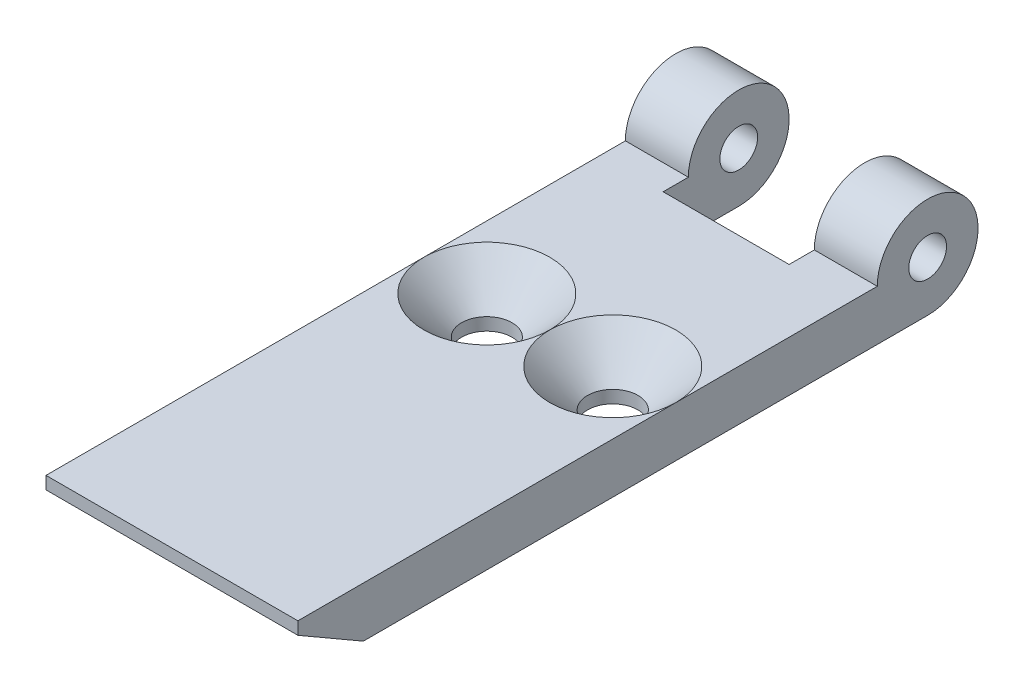
ISO-10303-21;
HEADER;
FILE_DESCRIPTION(('STEP AP214'),'2;1');
FILE_NAME('part.step','',(''),(''),'','','');
FILE_SCHEMA(('AUTOMOTIVE_DESIGN { 1 0 10303 214 1 1 1 1 }'));
ENDSEC;
DATA;
#1=APPLICATION_CONTEXT('core data for automotive mechanical design processes');
#2=APPLICATION_PROTOCOL_DEFINITION('international standard','automotive_design',2000,#1);
#3=PRODUCT_CONTEXT('',#1,'mechanical');
#4=PRODUCT('Part','Part','',(#3));
#5=PRODUCT_RELATED_PRODUCT_CATEGORY('part','',(#4));
#6=PRODUCT_DEFINITION_FORMATION('','',#4);
#7=PRODUCT_DEFINITION_CONTEXT('part definition',#1,'design');
#8=PRODUCT_DEFINITION('design','',#6,#7);
#9=PRODUCT_DEFINITION_SHAPE('','',#8);
#10=(LENGTH_UNIT() NAMED_UNIT(*) SI_UNIT(.MILLI.,.METRE.));
#11=(NAMED_UNIT(*) PLANE_ANGLE_UNIT() SI_UNIT($,.RADIAN.));
#12=(NAMED_UNIT(*) SI_UNIT($,.STERADIAN.) SOLID_ANGLE_UNIT());
#13=UNCERTAINTY_MEASURE_WITH_UNIT(LENGTH_MEASURE(1.E-05),#10,'distance_accuracy_value','');
#14=(GEOMETRIC_REPRESENTATION_CONTEXT(3) GLOBAL_UNCERTAINTY_ASSIGNED_CONTEXT((#13)) GLOBAL_UNIT_ASSIGNED_CONTEXT((#10,
#11,#12)) REPRESENTATION_CONTEXT('',''));
#15=CARTESIAN_POINT('',(0.,0.,0.));
#16=DIRECTION('',(0.,0.,1.));
#17=DIRECTION('',(1.,0.,0.));
#18=AXIS2_PLACEMENT_3D('',#15,#16,#17);
#19=CARTESIAN_POINT('',(10.,0.,50.));
#20=DIRECTION('',(0.,-1.,0.));
#21=DIRECTION('',(0.,0.,-1.));
#22=AXIS2_PLACEMENT_3D('',#19,#20,#21);
#23=PLANE('',#22);
#24=DIRECTION('',(0.,0.,1.));
#25=VECTOR('',#24,1.);
#26=CARTESIAN_POINT('',(10.,0.,50.));
#27=LINE('',#26,#25);
#28=CARTESIAN_POINT('',(10.,0.,20.));
#29=VERTEX_POINT('',#28);
#30=CARTESIAN_POINT('',(10.,0.,50.));
#31=VERTEX_POINT('',#30);
#32=EDGE_CURVE('E172',#29,#31,#27,.T.);
#33=ORIENTED_EDGE('',*,*,#32,.F.);
#34=CARTESIAN_POINT('',(5.,0.,20.));
#35=DIRECTION('',(0.,-1.,0.));
#36=DIRECTION('',(0.,0.,-1.));
#37=AXIS2_PLACEMENT_3D('',#34,#35,#36);
#38=CIRCLE('',#37,5.);
#39=CARTESIAN_POINT('',(0.,0.,20.));
#40=VERTEX_POINT('',#39);
#41=EDGE_CURVE('E219',#29,#40,#38,.T.);
#42=ORIENTED_EDGE('',*,*,#41,.T.);
#43=CARTESIAN_POINT('',(-5.,0.,20.));
#44=DIRECTION('',(0.,-1.,0.));
#45=DIRECTION('',(0.,0.,-1.));
#46=AXIS2_PLACEMENT_3D('',#43,#44,#45);
#47=CIRCLE('',#46,5.);
#48=CARTESIAN_POINT('',(-10.,0.,20.));
#49=VERTEX_POINT('',#48);
#50=EDGE_CURVE('E51',#40,#49,#47,.T.);
#51=ORIENTED_EDGE('',*,*,#50,.T.);
#52=DIRECTION('',(0.,0.,1.));
#53=VECTOR('',#52,1.);
#54=CARTESIAN_POINT('',(-10.,0.,50.));
#55=LINE('',#54,#53);
#56=CARTESIAN_POINT('',(-10.,0.,50.));
#57=VERTEX_POINT('',#56);
#58=EDGE_CURVE('E186',#49,#57,#55,.T.);
#59=ORIENTED_EDGE('',*,*,#58,.T.);
#60=DIRECTION('',(-1.,0.,0.));
#61=VECTOR('',#60,1.);
#62=CARTESIAN_POINT('',(10.,0.,50.));
#63=LINE('',#62,#61);
#64=EDGE_CURVE('E204',#31,#57,#63,.T.);
#65=ORIENTED_EDGE('',*,*,#64,.F.);
#66=EDGE_LOOP('',(#33,#42,#51,#59,#65));
#67=FACE_BOUND('',#66,.T.);
#68=ADVANCED_FACE('F36',(#67),#23,.F.);
#69=CARTESIAN_POINT('',(10.,0.,0.));
#70=DIRECTION('',(-1.,0.,0.));
#71=DIRECTION('',(0.,0.,1.));
#72=AXIS2_PLACEMENT_3D('',#69,#70,#71);
#73=CYLINDRICAL_SURFACE('',#72,4.);
#74=CARTESIAN_POINT('',(5.,0.,0.));
#75=DIRECTION('',(1.,0.,0.));
#76=DIRECTION('',(0.,0.,-1.));
#77=AXIS2_PLACEMENT_3D('',#74,#75,#76);
#78=CIRCLE('',#77,4.);
#79=CARTESIAN_POINT('',(5.,-4.00000000000001,0.));
#80=VERTEX_POINT('',#79);
#81=CARTESIAN_POINT('',(5.,0.,4.));
#82=VERTEX_POINT('',#81);
#83=EDGE_CURVE('E134',#80,#82,#78,.T.);
#84=ORIENTED_EDGE('',*,*,#83,.T.);
#85=DIRECTION('',(-1.,0.,0.));
#86=VECTOR('',#85,1.);
#87=CARTESIAN_POINT('',(10.,0.,4.));
#88=LINE('',#87,#86);
#89=CARTESIAN_POINT('',(10.,0.,4.));
#90=VERTEX_POINT('',#89);
#91=EDGE_CURVE('E208',#90,#82,#88,.T.);
#92=ORIENTED_EDGE('',*,*,#91,.F.);
#93=CARTESIAN_POINT('',(10.,0.,0.));
#94=DIRECTION('',(1.,0.,0.));
#95=DIRECTION('',(0.,0.,-1.));
#96=AXIS2_PLACEMENT_3D('',#93,#94,#95);
#97=CIRCLE('',#96,4.);
#98=CARTESIAN_POINT('',(10.,-4.,0.));
#99=VERTEX_POINT('',#98);
#100=EDGE_CURVE('E169',#99,#90,#97,.T.);
#101=ORIENTED_EDGE('',*,*,#100,.F.);
#102=DIRECTION('',(-1.,0.,0.));
#103=VECTOR('',#102,1.);
#104=CARTESIAN_POINT('',(10.,-4.,0.));
#105=LINE('',#104,#103);
#106=EDGE_CURVE('E196',#99,#80,#105,.T.);
#107=ORIENTED_EDGE('',*,*,#106,.T.);
#108=EDGE_LOOP('',(#84,#92,#101,#107));
#109=FACE_BOUND('',#108,.T.);
#110=ADVANCED_FACE('F242',(#109),#73,.T.);
#111=CARTESIAN_POINT('',(10.,0.,0.));
#112=DIRECTION('',(-1.,0.,0.));
#113=DIRECTION('',(0.,0.,1.));
#114=AXIS2_PLACEMENT_3D('',#111,#112,#113);
#115=CYLINDRICAL_SURFACE('',#114,1.5);
#116=CARTESIAN_POINT('',(5.,0.,0.));
#117=DIRECTION('',(1.,0.,0.));
#118=DIRECTION('',(0.,0.,-1.));
#119=AXIS2_PLACEMENT_3D('',#116,#117,#118);
#120=CIRCLE('',#119,1.5);
#121=CARTESIAN_POINT('',(5.,0.,-1.5));
#122=VERTEX_POINT('',#121);
#123=EDGE_CURVE('E157',#122,#122,#120,.T.);
#124=ORIENTED_EDGE('',*,*,#123,.F.);
#125=EDGE_LOOP('',(#124));
#126=FACE_BOUND('',#125,.T.);
#127=CARTESIAN_POINT('',(10.,0.,0.));
#128=DIRECTION('',(1.,0.,0.));
#129=DIRECTION('',(0.,0.,-1.));
#130=AXIS2_PLACEMENT_3D('',#127,#128,#129);
#131=CIRCLE('',#130,1.5);
#132=CARTESIAN_POINT('',(10.,0.,-1.5));
#133=VERTEX_POINT('',#132);
#134=EDGE_CURVE('E163',#133,#133,#131,.T.);
#135=ORIENTED_EDGE('',*,*,#134,.T.);
#136=EDGE_LOOP('',(#135));
#137=FACE_BOUND('',#136,.T.);
#138=ADVANCED_FACE('F247',(#126,#137),#115,.F.);
#139=CARTESIAN_POINT('',(10.,0.,0.));
#140=DIRECTION('',(1.,0.,0.));
#141=DIRECTION('',(0.,0.,-1.));
#142=AXIS2_PLACEMENT_3D('',#139,#140,#141);
#143=PLANE('',#142);
#144=ORIENTED_EDGE('',*,*,#100,.T.);
#145=EDGE_CURVE('E174',#90,#29,#27,.T.);
#146=ORIENTED_EDGE('',*,*,#145,.T.);
#147=ORIENTED_EDGE('',*,*,#32,.T.);
#148=DIRECTION('',(0.,-1.,0.));
#149=VECTOR('',#148,1.);
#150=CARTESIAN_POINT('',(10.,-1.,50.));
#151=LINE('',#150,#149);
#152=CARTESIAN_POINT('',(10.,-1.,50.));
#153=VERTEX_POINT('',#152);
#154=EDGE_CURVE('E177',#31,#153,#151,.T.);
#155=ORIENTED_EDGE('',*,*,#154,.T.);
#156=DIRECTION('',(0.,-0.500000000000001,-0.866025403784438));
#157=VECTOR('',#156,1.);
#158=CARTESIAN_POINT('',(10.,-4.00000000000001,44.8038475772934));
#159=LINE('',#158,#157);
#160=CARTESIAN_POINT('',(10.,-4.00000000000001,44.8038475772934));
#161=VERTEX_POINT('',#160);
#162=EDGE_CURVE('E179',#153,#161,#159,.T.);
#163=ORIENTED_EDGE('',*,*,#162,.T.);
#164=DIRECTION('',(0.,0.,-1.));
#165=VECTOR('',#164,1.);
#166=CARTESIAN_POINT('',(10.,-4.,0.));
#167=LINE('',#166,#165);
#168=EDGE_CURVE('E181',#161,#99,#167,.T.);
#169=ORIENTED_EDGE('',*,*,#168,.T.);
#170=EDGE_LOOP('',(#144,#146,#147,#155,#163,#169));
#171=FACE_BOUND('',#170,.T.);
#172=ORIENTED_EDGE('',*,*,#134,.F.);
#173=EDGE_LOOP('',(#172));
#174=FACE_BOUND('',#173,.T.);
#175=ADVANCED_FACE('F265',(#171,#174),#143,.T.);
#176=CARTESIAN_POINT('',(-10.,0.,0.));
#177=DIRECTION('',(1.,0.,0.));
#178=DIRECTION('',(0.,0.,-1.));
#179=AXIS2_PLACEMENT_3D('',#176,#177,#178);
#180=PLANE('',#179);
#181=CARTESIAN_POINT('',(-10.,0.,0.));
#182=DIRECTION('',(1.,0.,0.));
#183=DIRECTION('',(0.,0.,-1.));
#184=AXIS2_PLACEMENT_3D('',#181,#182,#183);
#185=CIRCLE('',#184,4.);
#186=CARTESIAN_POINT('',(-10.,-4.,0.));
#187=VERTEX_POINT('',#186);
#188=CARTESIAN_POINT('',(-10.,0.,4.));
#189=VERTEX_POINT('',#188);
#190=EDGE_CURVE('E166',#187,#189,#185,.T.);
#191=ORIENTED_EDGE('',*,*,#190,.F.);
#192=DIRECTION('',(0.,0.,-1.));
#193=VECTOR('',#192,1.);
#194=CARTESIAN_POINT('',(-10.,-4.,0.));
#195=LINE('',#194,#193);
#196=CARTESIAN_POINT('',(-10.,-4.00000000000001,44.8038475772934));
#197=VERTEX_POINT('',#196);
#198=EDGE_CURVE('E173',#197,#187,#195,.T.);
#199=ORIENTED_EDGE('',*,*,#198,.F.);
#200=DIRECTION('',(0.,-0.500000000000001,-0.866025403784438));
#201=VECTOR('',#200,1.);
#202=CARTESIAN_POINT('',(-10.,-4.00000000000001,44.8038475772934));
#203=LINE('',#202,#201);
#204=CARTESIAN_POINT('',(-10.,-1.,50.));
#205=VERTEX_POINT('',#204);
#206=EDGE_CURVE('E192',#205,#197,#203,.T.);
#207=ORIENTED_EDGE('',*,*,#206,.F.);
#208=DIRECTION('',(0.,-1.,0.));
#209=VECTOR('',#208,1.);
#210=CARTESIAN_POINT('',(-10.,-1.,50.));
#211=LINE('',#210,#209);
#212=EDGE_CURVE('E190',#57,#205,#211,.T.);
#213=ORIENTED_EDGE('',*,*,#212,.F.);
#214=ORIENTED_EDGE('',*,*,#58,.F.);
#215=EDGE_CURVE('E187',#189,#49,#55,.T.);
#216=ORIENTED_EDGE('',*,*,#215,.F.);
#217=EDGE_LOOP('',(#191,#199,#207,#213,#214,#216));
#218=FACE_BOUND('',#217,.T.);
#219=CARTESIAN_POINT('',(-10.,0.,0.));
#220=DIRECTION('',(1.,0.,0.));
#221=DIRECTION('',(0.,0.,-1.));
#222=AXIS2_PLACEMENT_3D('',#219,#220,#221);
#223=CIRCLE('',#222,1.5);
#224=CARTESIAN_POINT('',(-10.,0.,-1.5));
#225=VERTEX_POINT('',#224);
#226=EDGE_CURVE('E162',#225,#225,#223,.T.);
#227=ORIENTED_EDGE('',*,*,#226,.T.);
#228=EDGE_LOOP('',(#227));
#229=FACE_BOUND('',#228,.T.);
#230=ADVANCED_FACE('F260',(#218,#229),#180,.F.);
#231=CARTESIAN_POINT('',(-5.,0.,4.));
#232=VERTEX_POINT('',#231);
#233=EDGE_CURVE('E207',#232,#189,#88,.T.);
#234=ORIENTED_EDGE('',*,*,#233,.F.);
#235=CARTESIAN_POINT('',(-5.,0.,0.));
#236=DIRECTION('',(-1.,0.,0.));
#237=DIRECTION('',(0.,0.,1.));
#238=AXIS2_PLACEMENT_3D('',#235,#236,#237);
#239=CIRCLE('',#238,4.);
#240=CARTESIAN_POINT('',(-5.,-4.00000000000001,0.));
#241=VERTEX_POINT('',#240);
#242=EDGE_CURVE('E155',#232,#241,#239,.T.);
#243=ORIENTED_EDGE('',*,*,#242,.T.);
#244=EDGE_CURVE('E183',#241,#187,#105,.T.);
#245=ORIENTED_EDGE('',*,*,#244,.T.);
#246=ORIENTED_EDGE('',*,*,#190,.T.);
#247=EDGE_LOOP('',(#234,#243,#245,#246));
#248=FACE_BOUND('',#247,.T.);
#249=ADVANCED_FACE('F250',(#248),#73,.T.);
#250=CARTESIAN_POINT('',(-5.,0.,20.));
#251=DIRECTION('',(0.,-1.,0.));
#252=DIRECTION('',(0.,0.,-1.));
#253=AXIS2_PLACEMENT_3D('',#250,#251,#252);
#254=CIRCLE('',#253,5.);
#255=EDGE_CURVE('E216',#49,#40,#254,.T.);
#256=ORIENTED_EDGE('',*,*,#255,.T.);
#257=CARTESIAN_POINT('',(5.,0.,20.));
#258=DIRECTION('',(0.,-1.,0.));
#259=DIRECTION('',(0.,0.,-1.));
#260=AXIS2_PLACEMENT_3D('',#257,#258,#259);
#261=CIRCLE('',#260,5.);
#262=EDGE_CURVE('E58',#40,#29,#261,.T.);
#263=ORIENTED_EDGE('',*,*,#262,.T.);
#264=ORIENTED_EDGE('',*,*,#145,.F.);
#265=ORIENTED_EDGE('',*,*,#91,.T.);
#266=DIRECTION('',(0.,0.,1.));
#267=VECTOR('',#266,1.);
#268=CARTESIAN_POINT('',(5.,0.,50.));
#269=LINE('',#268,#267);
#270=CARTESIAN_POINT('',(5.,0.,6.));
#271=VERTEX_POINT('',#270);
#272=EDGE_CURVE('E158',#82,#271,#269,.T.);
#273=ORIENTED_EDGE('',*,*,#272,.T.);
#274=DIRECTION('',(-1.,0.,0.));
#275=VECTOR('',#274,1.);
#276=CARTESIAN_POINT('',(10.,0.,6.));
#277=LINE('',#276,#275);
#278=CARTESIAN_POINT('',(-5.,0.,6.));
#279=VERTEX_POINT('',#278);
#280=EDGE_CURVE('E124',#271,#279,#277,.T.);
#281=ORIENTED_EDGE('',*,*,#280,.T.);
#282=DIRECTION('',(0.,0.,-1.));
#283=VECTOR('',#282,1.);
#284=CARTESIAN_POINT('',(-5.,0.,50.));
#285=LINE('',#284,#283);
#286=EDGE_CURVE('E152',#279,#232,#285,.T.);
#287=ORIENTED_EDGE('',*,*,#286,.T.);
#288=ORIENTED_EDGE('',*,*,#233,.T.);
#289=ORIENTED_EDGE('',*,*,#215,.T.);
#290=EDGE_LOOP('',(#256,#263,#264,#265,#273,#281,#287,#288,#289));
#291=FACE_BOUND('',#290,.T.);
#292=ADVANCED_FACE('F234',(#291),#23,.F.);
#293=CARTESIAN_POINT('',(10.,-1.,50.));
#294=DIRECTION('',(0.,0.,-1.));
#295=DIRECTION('',(-1.,0.,0.));
#296=AXIS2_PLACEMENT_3D('',#293,#294,#295);
#297=PLANE('',#296);
#298=ORIENTED_EDGE('',*,*,#212,.T.);
#299=DIRECTION('',(-1.,0.,0.));
#300=VECTOR('',#299,1.);
#301=CARTESIAN_POINT('',(10.,-1.,50.));
#302=LINE('',#301,#300);
#303=EDGE_CURVE('E201',#153,#205,#302,.T.);
#304=ORIENTED_EDGE('',*,*,#303,.F.);
#305=ORIENTED_EDGE('',*,*,#154,.F.);
#306=ORIENTED_EDGE('',*,*,#64,.T.);
#307=EDGE_LOOP('',(#298,#304,#305,#306));
#308=FACE_BOUND('',#307,.T.);
#309=ADVANCED_FACE('F253',(#308),#297,.F.);
#310=CARTESIAN_POINT('',(10.,-4.00000000000001,44.8038475772934));
#311=DIRECTION('',(0.,0.866025403784438,-0.500000000000001));
#312=DIRECTION('',(0.,0.500000000000001,0.866025403784438));
#313=AXIS2_PLACEMENT_3D('',#310,#311,#312);
#314=PLANE('',#313);
#315=ORIENTED_EDGE('',*,*,#206,.T.);
#316=DIRECTION('',(-1.,0.,0.));
#317=VECTOR('',#316,1.);
#318=CARTESIAN_POINT('',(10.,-4.00000000000001,44.8038475772934));
#319=LINE('',#318,#317);
#320=EDGE_CURVE('E198',#161,#197,#319,.T.);
#321=ORIENTED_EDGE('',*,*,#320,.F.);
#322=ORIENTED_EDGE('',*,*,#162,.F.);
#323=ORIENTED_EDGE('',*,*,#303,.T.);
#324=EDGE_LOOP('',(#315,#321,#322,#323));
#325=FACE_BOUND('',#324,.T.);
#326=ADVANCED_FACE('F258',(#325),#314,.F.);
#327=CARTESIAN_POINT('',(10.,-4.,0.));
#328=DIRECTION('',(0.,1.,0.));
#329=DIRECTION('',(0.,0.,1.));
#330=AXIS2_PLACEMENT_3D('',#327,#328,#329);
#331=PLANE('',#330);
#332=CARTESIAN_POINT('',(5.,-4.00000000000001,20.));
#333=DIRECTION('',(0.,1.,0.));
#334=DIRECTION('',(0.,0.,1.));
#335=AXIS2_PLACEMENT_3D('',#332,#333,#334);
#336=CIRCLE('',#335,2.);
#337=CARTESIAN_POINT('',(5.,-4.00000000000001,22.));
#338=VERTEX_POINT('',#337);
#339=EDGE_CURVE('E128',#338,#338,#336,.T.);
#340=ORIENTED_EDGE('',*,*,#339,.T.);
#341=EDGE_LOOP('',(#340));
#342=FACE_BOUND('',#341,.T.);
#343=CARTESIAN_POINT('',(-5.,-4.00000000000001,20.));
#344=DIRECTION('',(0.,1.,0.));
#345=DIRECTION('',(0.,0.,1.));
#346=AXIS2_PLACEMENT_3D('',#343,#344,#345);
#347=CIRCLE('',#346,2.);
#348=CARTESIAN_POINT('',(-5.,-4.00000000000001,22.));
#349=VERTEX_POINT('',#348);
#350=EDGE_CURVE('E148',#349,#349,#347,.T.);
#351=ORIENTED_EDGE('',*,*,#350,.T.);
#352=EDGE_LOOP('',(#351));
#353=FACE_BOUND('',#352,.T.);
#354=DIRECTION('',(1.,0.,0.));
#355=VECTOR('',#354,1.);
#356=CARTESIAN_POINT('',(5.,-4.00000000000001,6.));
#357=LINE('',#356,#355);
#358=CARTESIAN_POINT('',(-5.,-4.,6.));
#359=VERTEX_POINT('',#358);
#360=CARTESIAN_POINT('',(5.,-4.00000000000001,6.));
#361=VERTEX_POINT('',#360);
#362=EDGE_CURVE('E121',#359,#361,#357,.T.);
#363=ORIENTED_EDGE('',*,*,#362,.T.);
#364=DIRECTION('',(0.,0.,-1.));
#365=VECTOR('',#364,1.);
#366=CARTESIAN_POINT('',(5.,-4.00000000000001,-4.));
#367=LINE('',#366,#365);
#368=EDGE_CURVE('E132',#361,#80,#367,.T.);
#369=ORIENTED_EDGE('',*,*,#368,.T.);
#370=ORIENTED_EDGE('',*,*,#106,.F.);
#371=ORIENTED_EDGE('',*,*,#168,.F.);
#372=ORIENTED_EDGE('',*,*,#320,.T.);
#373=ORIENTED_EDGE('',*,*,#198,.T.);
#374=ORIENTED_EDGE('',*,*,#244,.F.);
#375=DIRECTION('',(0.,0.,1.));
#376=VECTOR('',#375,1.);
#377=CARTESIAN_POINT('',(-5.,-4.00000000000001,-4.));
#378=LINE('',#377,#376);
#379=EDGE_CURVE('E138',#241,#359,#378,.T.);
#380=ORIENTED_EDGE('',*,*,#379,.T.);
#381=EDGE_LOOP('',(#363,#369,#370,#371,#372,#373,#374,#380));
#382=FACE_BOUND('',#381,.T.);
#383=ADVANCED_FACE('F141',(#342,#353,#382),#331,.F.);
#384=CARTESIAN_POINT('',(-5.,0.,0.));
#385=DIRECTION('',(-1.,0.,0.));
#386=DIRECTION('',(0.,0.,1.));
#387=AXIS2_PLACEMENT_3D('',#384,#385,#386);
#388=CIRCLE('',#387,1.5);
#389=CARTESIAN_POINT('',(-5.,0.,1.5));
#390=VERTEX_POINT('',#389);
#391=EDGE_CURVE('E151',#390,#390,#388,.T.);
#392=ORIENTED_EDGE('',*,*,#391,.F.);
#393=EDGE_LOOP('',(#392));
#394=FACE_BOUND('',#393,.T.);
#395=ORIENTED_EDGE('',*,*,#226,.F.);
#396=EDGE_LOOP('',(#395));
#397=FACE_BOUND('',#396,.T.);
#398=ADVANCED_FACE('F294',(#394,#397),#115,.F.);
#399=CARTESIAN_POINT('',(5.,-4.00000000000001,6.));
#400=DIRECTION('',(0.,0.,1.));
#401=DIRECTION('',(1.,0.,0.));
#402=AXIS2_PLACEMENT_3D('',#399,#400,#401);
#403=PLANE('',#402);
#404=DIRECTION('',(0.,1.,0.));
#405=VECTOR('',#404,1.);
#406=CARTESIAN_POINT('',(5.,-4.00000000000001,6.));
#407=LINE('',#406,#405);
#408=EDGE_CURVE('E116',#361,#271,#407,.T.);
#409=ORIENTED_EDGE('',*,*,#408,.F.);
#410=ORIENTED_EDGE('',*,*,#362,.F.);
#411=DIRECTION('',(0.,1.,0.));
#412=VECTOR('',#411,1.);
#413=CARTESIAN_POINT('',(-5.,-4.00000000000001,6.));
#414=LINE('',#413,#412);
#415=EDGE_CURVE('E129',#359,#279,#414,.T.);
#416=ORIENTED_EDGE('',*,*,#415,.T.);
#417=ORIENTED_EDGE('',*,*,#280,.F.);
#418=EDGE_LOOP('',(#409,#410,#416,#417));
#419=FACE_BOUND('',#418,.T.);
#420=ADVANCED_FACE('F118',(#419),#403,.F.);
#421=CARTESIAN_POINT('',(5.,-4.00000000000001,-4.));
#422=DIRECTION('',(1.,0.,0.));
#423=DIRECTION('',(0.,0.,-1.));
#424=AXIS2_PLACEMENT_3D('',#421,#422,#423);
#425=PLANE('',#424);
#426=ORIENTED_EDGE('',*,*,#123,.T.);
#427=EDGE_LOOP('',(#426));
#428=FACE_BOUND('',#427,.T.);
#429=ORIENTED_EDGE('',*,*,#368,.F.);
#430=ORIENTED_EDGE('',*,*,#408,.T.);
#431=ORIENTED_EDGE('',*,*,#272,.F.);
#432=ORIENTED_EDGE('',*,*,#83,.F.);
#433=EDGE_LOOP('',(#429,#430,#431,#432));
#434=FACE_BOUND('',#433,.T.);
#435=ADVANCED_FACE('F133',(#428,#434),#425,.F.);
#436=CARTESIAN_POINT('',(-5.,-4.00000000000001,-4.));
#437=DIRECTION('',(-1.,0.,0.));
#438=DIRECTION('',(0.,0.,1.));
#439=AXIS2_PLACEMENT_3D('',#436,#437,#438);
#440=PLANE('',#439);
#441=ORIENTED_EDGE('',*,*,#391,.T.);
#442=EDGE_LOOP('',(#441));
#443=FACE_BOUND('',#442,.T.);
#444=ORIENTED_EDGE('',*,*,#242,.F.);
#445=ORIENTED_EDGE('',*,*,#286,.F.);
#446=ORIENTED_EDGE('',*,*,#415,.F.);
#447=ORIENTED_EDGE('',*,*,#379,.F.);
#448=EDGE_LOOP('',(#444,#445,#446,#447));
#449=FACE_BOUND('',#448,.T.);
#450=ADVANCED_FACE('F306',(#443,#449),#440,.F.);
#451=CARTESIAN_POINT('',(-5.,-4.00000000000001,20.));
#452=DIRECTION('',(0.,1.,0.));
#453=DIRECTION('',(0.,0.,1.));
#454=AXIS2_PLACEMENT_3D('',#451,#452,#453);
#455=CYLINDRICAL_SURFACE('',#454,2.);
#456=CARTESIAN_POINT('',(-5.,-3.00000000000001,20.));
#457=DIRECTION('',(0.,-1.,0.));
#458=DIRECTION('',(0.,0.,-1.));
#459=AXIS2_PLACEMENT_3D('',#456,#457,#458);
#460=CIRCLE('',#459,2.);
#461=CARTESIAN_POINT('',(-5.,-3.00000000000001,18.));
#462=VERTEX_POINT('',#461);
#463=EDGE_CURVE('E11',#462,#462,#460,.F.);
#464=ORIENTED_EDGE('',*,*,#463,.T.);
#465=EDGE_LOOP('',(#464));
#466=FACE_BOUND('',#465,.T.);
#467=ORIENTED_EDGE('',*,*,#350,.F.);
#468=EDGE_LOOP('',(#467));
#469=FACE_BOUND('',#468,.T.);
#470=ADVANCED_FACE('F303',(#466,#469),#455,.F.);
#471=CARTESIAN_POINT('',(5.,-4.00000000000001,20.));
#472=DIRECTION('',(0.,1.,0.));
#473=DIRECTION('',(0.,0.,1.));
#474=AXIS2_PLACEMENT_3D('',#471,#472,#473);
#475=CYLINDRICAL_SURFACE('',#474,2.);
#476=CARTESIAN_POINT('',(5.,-3.00000000000001,20.));
#477=DIRECTION('',(0.,-1.,0.));
#478=DIRECTION('',(0.,0.,-1.));
#479=AXIS2_PLACEMENT_3D('',#476,#477,#478);
#480=CIRCLE('',#479,2.);
#481=CARTESIAN_POINT('',(5.,-3.00000000000001,18.));
#482=VERTEX_POINT('',#481);
#483=EDGE_CURVE('E45',#482,#482,#480,.F.);
#484=ORIENTED_EDGE('',*,*,#483,.T.);
#485=EDGE_LOOP('',(#484));
#486=FACE_BOUND('',#485,.T.);
#487=ORIENTED_EDGE('',*,*,#339,.F.);
#488=EDGE_LOOP('',(#487));
#489=FACE_BOUND('',#488,.T.);
#490=ADVANCED_FACE('F224',(#486,#489),#475,.F.);
#491=CARTESIAN_POINT('',(5.,0.,20.));
#492=DIRECTION('',(0.,1.,0.));
#493=DIRECTION('',(0.,0.,1.));
#494=AXIS2_PLACEMENT_3D('',#491,#492,#493);
#495=CONICAL_SURFACE('',#494,5.,0.785398163397447);
#496=ORIENTED_EDGE('',*,*,#483,.F.);
#497=EDGE_LOOP('',(#496));
#498=FACE_BOUND('',#497,.T.);
#499=ORIENTED_EDGE('',*,*,#262,.F.);
#500=ORIENTED_EDGE('',*,*,#41,.F.);
#501=EDGE_LOOP('',(#499,#500));
#502=FACE_BOUND('',#501,.T.);
#503=ADVANCED_FACE('F227',(#498,#502),#495,.F.);
#504=CARTESIAN_POINT('',(-5.,0.,20.));
#505=DIRECTION('',(0.,1.,0.));
#506=DIRECTION('',(0.,0.,1.));
#507=AXIS2_PLACEMENT_3D('',#504,#505,#506);
#508=CONICAL_SURFACE('',#507,5.,0.785398163397447);
#509=ORIENTED_EDGE('',*,*,#463,.F.);
#510=EDGE_LOOP('',(#509));
#511=FACE_BOUND('',#510,.T.);
#512=ORIENTED_EDGE('',*,*,#50,.F.);
#513=ORIENTED_EDGE('',*,*,#255,.F.);
#514=EDGE_LOOP('',(#512,#513));
#515=FACE_BOUND('',#514,.T.);
#516=ADVANCED_FACE('F39',(#511,#515),#508,.F.);
#517=CLOSED_SHELL('',(#68,#110,#138,#175,#230,#249,#292,#309,#326,#383,#398,#420,#435,#450,#470,
#490,#503,#516));
#518=MANIFOLD_SOLID_BREP('B2',#517);
#519=ADVANCED_BREP_SHAPE_REPRESENTATION('',(#18,#518),#14);
#520=SHAPE_DEFINITION_REPRESENTATION(#9,#519);
ENDSEC;
END-ISO-10303-21;
